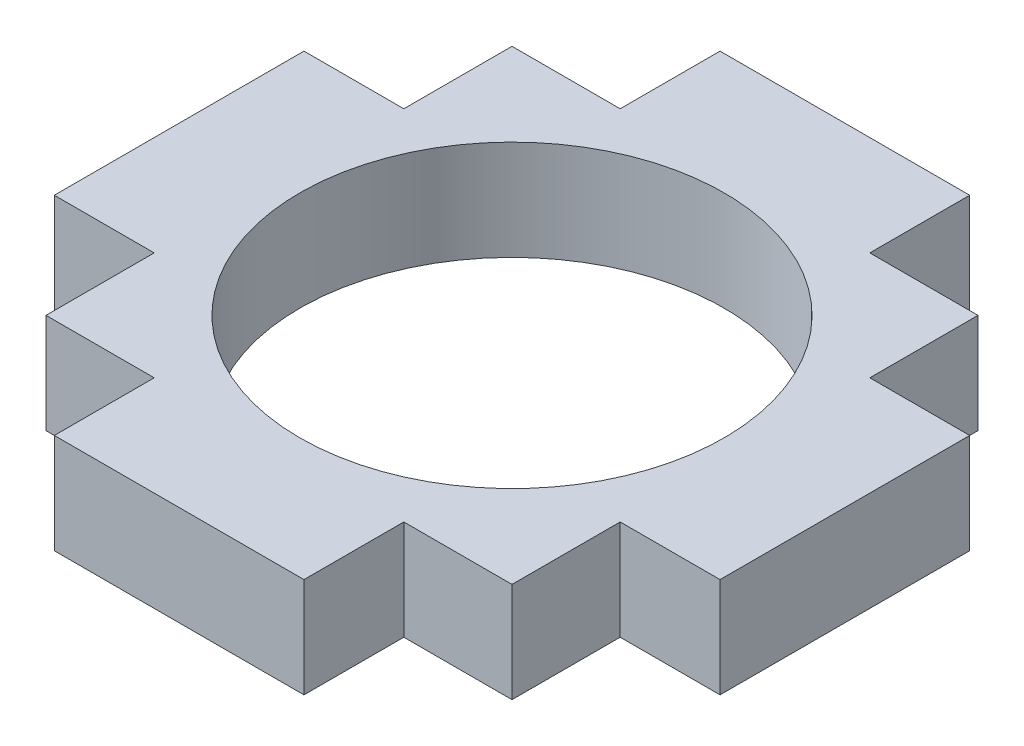
ISO-10303-21;
HEADER;
FILE_DESCRIPTION(('STEP AP214'),'2;1');
FILE_NAME('part.step','',(''),(''),'','','');
FILE_SCHEMA(('AUTOMOTIVE_DESIGN { 1 0 10303 214 1 1 1 1 }'));
ENDSEC;
DATA;
#1=APPLICATION_CONTEXT('core data for automotive mechanical design processes');
#2=APPLICATION_PROTOCOL_DEFINITION('international standard','automotive_design',2000,#1);
#3=PRODUCT_CONTEXT('',#1,'mechanical');
#4=PRODUCT('Part','Part','',(#3));
#5=PRODUCT_RELATED_PRODUCT_CATEGORY('part','',(#4));
#6=PRODUCT_DEFINITION_FORMATION('','',#4);
#7=PRODUCT_DEFINITION_CONTEXT('part definition',#1,'design');
#8=PRODUCT_DEFINITION('design','',#6,#7);
#9=PRODUCT_DEFINITION_SHAPE('','',#8);
#10=(LENGTH_UNIT() NAMED_UNIT(*) SI_UNIT(.MILLI.,.METRE.));
#11=(NAMED_UNIT(*) PLANE_ANGLE_UNIT() SI_UNIT($,.RADIAN.));
#12=(NAMED_UNIT(*) SI_UNIT($,.STERADIAN.) SOLID_ANGLE_UNIT());
#13=UNCERTAINTY_MEASURE_WITH_UNIT(LENGTH_MEASURE(1.E-05),#10,'distance_accuracy_value','');
#14=(GEOMETRIC_REPRESENTATION_CONTEXT(3) GLOBAL_UNCERTAINTY_ASSIGNED_CONTEXT((#13)) GLOBAL_UNIT_ASSIGNED_CONTEXT((#10,
#11,#12)) REPRESENTATION_CONTEXT('',''));
#15=CARTESIAN_POINT('',(0.,0.,0.));
#16=DIRECTION('',(0.,0.,1.));
#17=DIRECTION('',(1.,0.,0.));
#18=AXIS2_PLACEMENT_3D('',#15,#16,#17);
#19=CARTESIAN_POINT('',(27.5,6.,0.));
#20=DIRECTION('',(-1.,0.,0.));
#21=DIRECTION('',(0.,0.,1.));
#22=AXIS2_PLACEMENT_3D('',#19,#20,#21);
#23=PLANE('',#22);
#24=DIRECTION('',(0.,0.,-1.));
#25=VECTOR('',#24,1.);
#26=CARTESIAN_POINT('',(27.5,0.,0.));
#27=LINE('',#26,#25);
#28=CARTESIAN_POINT('',(27.5,0.,0.));
#29=VERTEX_POINT('',#28);
#30=CARTESIAN_POINT('',(27.5,0.,-5.99999999999999));
#31=VERTEX_POINT('',#30);
#32=EDGE_CURVE('E218',#29,#31,#27,.T.);
#33=ORIENTED_EDGE('',*,*,#32,.T.);
#34=DIRECTION('',(0.,-1.,0.));
#35=VECTOR('',#34,1.);
#36=CARTESIAN_POINT('',(27.5,6.,-5.99999999999999));
#37=LINE('',#36,#35);
#38=CARTESIAN_POINT('',(27.5,6.,-5.99999999999999));
#39=VERTEX_POINT('',#38);
#40=EDGE_CURVE('E11',#39,#31,#37,.T.);
#41=ORIENTED_EDGE('',*,*,#40,.F.);
#42=DIRECTION('',(0.,0.,-1.));
#43=VECTOR('',#42,1.);
#44=CARTESIAN_POINT('',(27.5,6.,0.));
#45=LINE('',#44,#43);
#46=CARTESIAN_POINT('',(27.5,6.,0.));
#47=VERTEX_POINT('',#46);
#48=EDGE_CURVE('E417',#47,#39,#45,.T.);
#49=ORIENTED_EDGE('',*,*,#48,.F.);
#50=DIRECTION('',(0.,-1.,0.));
#51=VECTOR('',#50,1.);
#52=CARTESIAN_POINT('',(27.5,6.,0.));
#53=LINE('',#52,#51);
#54=EDGE_CURVE('E210',#47,#29,#53,.T.);
#55=ORIENTED_EDGE('',*,*,#54,.T.);
#56=EDGE_LOOP('',(#33,#41,#49,#55));
#57=FACE_BOUND('',#56,.T.);
#58=ADVANCED_FACE('F41',(#57),#23,.F.);
#59=CARTESIAN_POINT('',(0.,6.,-5.99999999999996));
#60=DIRECTION('',(0.,0.,-1.));
#61=DIRECTION('',(-1.,0.,0.));
#62=AXIS2_PLACEMENT_3D('',#59,#60,#61);
#63=PLANE('',#62);
#64=DIRECTION('',(1.,0.,0.));
#65=VECTOR('',#64,1.);
#66=CARTESIAN_POINT('',(0.,0.,-5.99999999999996));
#67=LINE('',#66,#65);
#68=CARTESIAN_POINT('',(34.,0.,-6.));
#69=VERTEX_POINT('',#68);
#70=EDGE_CURVE('E222',#31,#69,#67,.T.);
#71=ORIENTED_EDGE('',*,*,#70,.T.);
#72=DIRECTION('',(0.,-1.,0.));
#73=VECTOR('',#72,1.);
#74=CARTESIAN_POINT('',(34.,6.,-6.));
#75=LINE('',#74,#73);
#76=CARTESIAN_POINT('',(34.,6.,-6.));
#77=VERTEX_POINT('',#76);
#78=EDGE_CURVE('E51',#77,#69,#75,.T.);
#79=ORIENTED_EDGE('',*,*,#78,.F.);
#80=DIRECTION('',(1.,0.,0.));
#81=VECTOR('',#80,1.);
#82=CARTESIAN_POINT('',(0.,6.,-5.99999999999996));
#83=LINE('',#82,#81);
#84=EDGE_CURVE('E134',#39,#77,#83,.T.);
#85=ORIENTED_EDGE('',*,*,#84,.F.);
#86=ORIENTED_EDGE('',*,*,#40,.T.);
#87=EDGE_LOOP('',(#71,#79,#85,#86));
#88=FACE_BOUND('',#87,.T.);
#89=ADVANCED_FACE('F431',(#88),#63,.F.);
#90=CARTESIAN_POINT('',(34.,6.,0.));
#91=DIRECTION('',(-1.,0.,0.));
#92=DIRECTION('',(0.,0.,1.));
#93=AXIS2_PLACEMENT_3D('',#90,#91,#92);
#94=PLANE('',#93);
#95=DIRECTION('',(0.,0.,-1.));
#96=VECTOR('',#95,1.);
#97=CARTESIAN_POINT('',(34.,0.,0.));
#98=LINE('',#97,#96);
#99=CARTESIAN_POINT('',(34.,0.,-12.5));
#100=VERTEX_POINT('',#99);
#101=EDGE_CURVE('E225',#69,#100,#98,.T.);
#102=ORIENTED_EDGE('',*,*,#101,.T.);
#103=DIRECTION('',(0.,-1.,0.));
#104=VECTOR('',#103,1.);
#105=CARTESIAN_POINT('',(34.,6.,-12.5));
#106=LINE('',#105,#104);
#107=CARTESIAN_POINT('',(34.,6.,-12.5));
#108=VERTEX_POINT('',#107);
#109=EDGE_CURVE('E337',#108,#100,#106,.T.);
#110=ORIENTED_EDGE('',*,*,#109,.F.);
#111=DIRECTION('',(0.,0.,-1.));
#112=VECTOR('',#111,1.);
#113=CARTESIAN_POINT('',(34.,6.,0.));
#114=LINE('',#113,#112);
#115=EDGE_CURVE('E347',#77,#108,#114,.T.);
#116=ORIENTED_EDGE('',*,*,#115,.F.);
#117=ORIENTED_EDGE('',*,*,#78,.T.);
#118=EDGE_LOOP('',(#102,#110,#116,#117));
#119=FACE_BOUND('',#118,.T.);
#120=ADVANCED_FACE('F345',(#119),#94,.F.);
#121=CARTESIAN_POINT('',(0.,6.,-12.5));
#122=DIRECTION('',(0.,0.,-1.));
#123=DIRECTION('',(-1.,0.,0.));
#124=AXIS2_PLACEMENT_3D('',#121,#122,#123);
#125=PLANE('',#124);
#126=DIRECTION('',(1.,0.,0.));
#127=VECTOR('',#126,1.);
#128=CARTESIAN_POINT('',(0.,0.,-12.5));
#129=LINE('',#128,#127);
#130=CARTESIAN_POINT('',(40.,0.,-12.5));
#131=VERTEX_POINT('',#130);
#132=EDGE_CURVE('E228',#100,#131,#129,.T.);
#133=ORIENTED_EDGE('',*,*,#132,.T.);
#134=DIRECTION('',(0.,-1.,0.));
#135=VECTOR('',#134,1.);
#136=CARTESIAN_POINT('',(40.,6.,-12.5));
#137=LINE('',#136,#135);
#138=CARTESIAN_POINT('',(40.,6.,-12.5));
#139=VERTEX_POINT('',#138);
#140=EDGE_CURVE('E333',#139,#131,#137,.T.);
#141=ORIENTED_EDGE('',*,*,#140,.F.);
#142=DIRECTION('',(1.,0.,0.));
#143=VECTOR('',#142,1.);
#144=CARTESIAN_POINT('',(0.,6.,-12.5));
#145=LINE('',#144,#143);
#146=EDGE_CURVE('E366',#108,#139,#145,.T.);
#147=ORIENTED_EDGE('',*,*,#146,.F.);
#148=ORIENTED_EDGE('',*,*,#109,.T.);
#149=EDGE_LOOP('',(#133,#141,#147,#148));
#150=FACE_BOUND('',#149,.T.);
#151=ADVANCED_FACE('F355',(#150),#125,.F.);
#152=CARTESIAN_POINT('',(40.,6.,0.));
#153=DIRECTION('',(-1.,0.,0.));
#154=DIRECTION('',(0.,0.,1.));
#155=AXIS2_PLACEMENT_3D('',#152,#153,#154);
#156=PLANE('',#155);
#157=DIRECTION('',(0.,0.,-1.));
#158=VECTOR('',#157,1.);
#159=CARTESIAN_POINT('',(40.,0.,0.));
#160=LINE('',#159,#158);
#161=CARTESIAN_POINT('',(40.,0.,-27.5));
#162=VERTEX_POINT('',#161);
#163=EDGE_CURVE('E231',#131,#162,#160,.T.);
#164=ORIENTED_EDGE('',*,*,#163,.T.);
#165=DIRECTION('',(0.,-1.,0.));
#166=VECTOR('',#165,1.);
#167=CARTESIAN_POINT('',(40.,6.,-27.5));
#168=LINE('',#167,#166);
#169=CARTESIAN_POINT('',(40.,6.,-27.5));
#170=VERTEX_POINT('',#169);
#171=EDGE_CURVE('E330',#170,#162,#168,.T.);
#172=ORIENTED_EDGE('',*,*,#171,.F.);
#173=DIRECTION('',(0.,0.,-1.));
#174=VECTOR('',#173,1.);
#175=CARTESIAN_POINT('',(40.,6.,0.));
#176=LINE('',#175,#174);
#177=EDGE_CURVE('E361',#139,#170,#176,.T.);
#178=ORIENTED_EDGE('',*,*,#177,.F.);
#179=ORIENTED_EDGE('',*,*,#140,.T.);
#180=EDGE_LOOP('',(#164,#172,#178,#179));
#181=FACE_BOUND('',#180,.T.);
#182=ADVANCED_FACE('F359',(#181),#156,.F.);
#183=CARTESIAN_POINT('',(0.,6.,-27.5));
#184=DIRECTION('',(0.,0.,-1.));
#185=DIRECTION('',(-1.,0.,0.));
#186=AXIS2_PLACEMENT_3D('',#183,#184,#185);
#187=PLANE('',#186);
#188=DIRECTION('',(1.,0.,0.));
#189=VECTOR('',#188,1.);
#190=CARTESIAN_POINT('',(0.,0.,-27.5));
#191=LINE('',#190,#189);
#192=CARTESIAN_POINT('',(34.,0.,-27.5));
#193=VERTEX_POINT('',#192);
#194=EDGE_CURVE('E235',#193,#162,#191,.T.);
#195=ORIENTED_EDGE('',*,*,#194,.F.);
#196=DIRECTION('',(0.,-1.,0.));
#197=VECTOR('',#196,1.);
#198=CARTESIAN_POINT('',(34.,6.,-27.5));
#199=LINE('',#198,#197);
#200=CARTESIAN_POINT('',(34.,6.,-27.5));
#201=VERTEX_POINT('',#200);
#202=EDGE_CURVE('E327',#201,#193,#199,.T.);
#203=ORIENTED_EDGE('',*,*,#202,.F.);
#204=DIRECTION('',(1.,0.,0.));
#205=VECTOR('',#204,1.);
#206=CARTESIAN_POINT('',(0.,6.,-27.5));
#207=LINE('',#206,#205);
#208=EDGE_CURVE('E365',#201,#170,#207,.T.);
#209=ORIENTED_EDGE('',*,*,#208,.T.);
#210=ORIENTED_EDGE('',*,*,#171,.T.);
#211=EDGE_LOOP('',(#195,#203,#209,#210));
#212=FACE_BOUND('',#211,.T.);
#213=ADVANCED_FACE('F443',(#212),#187,.T.);
#214=CARTESIAN_POINT('',(34.,6.,0.));
#215=DIRECTION('',(1.,0.,0.));
#216=DIRECTION('',(0.,0.,-1.));
#217=AXIS2_PLACEMENT_3D('',#214,#215,#216);
#218=PLANE('',#217);
#219=DIRECTION('',(0.,0.,1.));
#220=VECTOR('',#219,1.);
#221=CARTESIAN_POINT('',(34.,0.,0.));
#222=LINE('',#221,#220);
#223=CARTESIAN_POINT('',(34.,0.,-34.));
#224=VERTEX_POINT('',#223);
#225=EDGE_CURVE('E239',#224,#193,#222,.T.);
#226=ORIENTED_EDGE('',*,*,#225,.F.);
#227=DIRECTION('',(0.,-1.,0.));
#228=VECTOR('',#227,1.);
#229=CARTESIAN_POINT('',(34.,6.,-34.));
#230=LINE('',#229,#228);
#231=CARTESIAN_POINT('',(34.,6.,-34.));
#232=VERTEX_POINT('',#231);
#233=EDGE_CURVE('E324',#232,#224,#230,.T.);
#234=ORIENTED_EDGE('',*,*,#233,.F.);
#235=DIRECTION('',(0.,0.,1.));
#236=VECTOR('',#235,1.);
#237=CARTESIAN_POINT('',(34.,6.,0.));
#238=LINE('',#237,#236);
#239=EDGE_CURVE('E370',#232,#201,#238,.T.);
#240=ORIENTED_EDGE('',*,*,#239,.T.);
#241=ORIENTED_EDGE('',*,*,#202,.T.);
#242=EDGE_LOOP('',(#226,#234,#240,#241));
#243=FACE_BOUND('',#242,.T.);
#244=ADVANCED_FACE('F446',(#243),#218,.T.);
#245=CARTESIAN_POINT('',(0.,6.,-34.));
#246=DIRECTION('',(0.,0.,-1.));
#247=DIRECTION('',(-1.,0.,0.));
#248=AXIS2_PLACEMENT_3D('',#245,#246,#247);
#249=PLANE('',#248);
#250=DIRECTION('',(1.,0.,0.));
#251=VECTOR('',#250,1.);
#252=CARTESIAN_POINT('',(0.,0.,-34.));
#253=LINE('',#252,#251);
#254=CARTESIAN_POINT('',(27.5,0.,-34.));
#255=VERTEX_POINT('',#254);
#256=EDGE_CURVE('E243',#255,#224,#253,.T.);
#257=ORIENTED_EDGE('',*,*,#256,.F.);
#258=DIRECTION('',(0.,-1.,0.));
#259=VECTOR('',#258,1.);
#260=CARTESIAN_POINT('',(27.5,6.,-34.));
#261=LINE('',#260,#259);
#262=CARTESIAN_POINT('',(27.5,6.,-34.));
#263=VERTEX_POINT('',#262);
#264=EDGE_CURVE('E321',#263,#255,#261,.T.);
#265=ORIENTED_EDGE('',*,*,#264,.F.);
#266=DIRECTION('',(1.,0.,0.));
#267=VECTOR('',#266,1.);
#268=CARTESIAN_POINT('',(0.,6.,-34.));
#269=LINE('',#268,#267);
#270=EDGE_CURVE('E378',#263,#232,#269,.T.);
#271=ORIENTED_EDGE('',*,*,#270,.T.);
#272=ORIENTED_EDGE('',*,*,#233,.T.);
#273=EDGE_LOOP('',(#257,#265,#271,#272));
#274=FACE_BOUND('',#273,.T.);
#275=ADVANCED_FACE('F450',(#274),#249,.T.);
#276=CARTESIAN_POINT('',(27.5,6.,0.));
#277=DIRECTION('',(1.,0.,0.));
#278=DIRECTION('',(0.,0.,-1.));
#279=AXIS2_PLACEMENT_3D('',#276,#277,#278);
#280=PLANE('',#279);
#281=DIRECTION('',(0.,0.,1.));
#282=VECTOR('',#281,1.);
#283=CARTESIAN_POINT('',(27.5,0.,0.));
#284=LINE('',#283,#282);
#285=CARTESIAN_POINT('',(27.5,0.,-40.));
#286=VERTEX_POINT('',#285);
#287=EDGE_CURVE('E247',#286,#255,#284,.T.);
#288=ORIENTED_EDGE('',*,*,#287,.F.);
#289=DIRECTION('',(0.,-1.,0.));
#290=VECTOR('',#289,1.);
#291=CARTESIAN_POINT('',(27.5,6.,-40.));
#292=LINE('',#291,#290);
#293=CARTESIAN_POINT('',(27.5,6.,-40.));
#294=VERTEX_POINT('',#293);
#295=EDGE_CURVE('E318',#294,#286,#292,.T.);
#296=ORIENTED_EDGE('',*,*,#295,.F.);
#297=DIRECTION('',(0.,0.,1.));
#298=VECTOR('',#297,1.);
#299=CARTESIAN_POINT('',(27.5,6.,0.));
#300=LINE('',#299,#298);
#301=EDGE_CURVE('E382',#294,#263,#300,.T.);
#302=ORIENTED_EDGE('',*,*,#301,.T.);
#303=ORIENTED_EDGE('',*,*,#264,.T.);
#304=EDGE_LOOP('',(#288,#296,#302,#303));
#305=FACE_BOUND('',#304,.T.);
#306=ADVANCED_FACE('F454',(#305),#280,.T.);
#307=CARTESIAN_POINT('',(0.,6.,-40.));
#308=DIRECTION('',(0.,0.,-1.));
#309=DIRECTION('',(-1.,0.,0.));
#310=AXIS2_PLACEMENT_3D('',#307,#308,#309);
#311=PLANE('',#310);
#312=DIRECTION('',(1.,0.,0.));
#313=VECTOR('',#312,1.);
#314=CARTESIAN_POINT('',(0.,0.,-40.));
#315=LINE('',#314,#313);
#316=CARTESIAN_POINT('',(12.5,0.,-40.));
#317=VERTEX_POINT('',#316);
#318=EDGE_CURVE('E251',#317,#286,#315,.T.);
#319=ORIENTED_EDGE('',*,*,#318,.F.);
#320=DIRECTION('',(0.,-1.,0.));
#321=VECTOR('',#320,1.);
#322=CARTESIAN_POINT('',(12.5,6.,-40.));
#323=LINE('',#322,#321);
#324=CARTESIAN_POINT('',(12.5,6.,-40.));
#325=VERTEX_POINT('',#324);
#326=EDGE_CURVE('E315',#325,#317,#323,.T.);
#327=ORIENTED_EDGE('',*,*,#326,.F.);
#328=DIRECTION('',(1.,0.,0.));
#329=VECTOR('',#328,1.);
#330=CARTESIAN_POINT('',(0.,6.,-40.));
#331=LINE('',#330,#329);
#332=EDGE_CURVE('E386',#325,#294,#331,.T.);
#333=ORIENTED_EDGE('',*,*,#332,.T.);
#334=ORIENTED_EDGE('',*,*,#295,.T.);
#335=EDGE_LOOP('',(#319,#327,#333,#334));
#336=FACE_BOUND('',#335,.T.);
#337=ADVANCED_FACE('F458',(#336),#311,.T.);
#338=CARTESIAN_POINT('',(12.5,6.,0.));
#339=DIRECTION('',(1.,0.,0.));
#340=DIRECTION('',(0.,0.,-1.));
#341=AXIS2_PLACEMENT_3D('',#338,#339,#340);
#342=PLANE('',#341);
#343=DIRECTION('',(0.,0.,1.));
#344=VECTOR('',#343,1.);
#345=CARTESIAN_POINT('',(12.5,0.,0.));
#346=LINE('',#345,#344);
#347=CARTESIAN_POINT('',(12.5,0.,-34.));
#348=VERTEX_POINT('',#347);
#349=EDGE_CURVE('E255',#317,#348,#346,.T.);
#350=ORIENTED_EDGE('',*,*,#349,.T.);
#351=DIRECTION('',(0.,-1.,0.));
#352=VECTOR('',#351,1.);
#353=CARTESIAN_POINT('',(12.5,6.,-34.));
#354=LINE('',#353,#352);
#355=CARTESIAN_POINT('',(12.5,6.,-34.));
#356=VERTEX_POINT('',#355);
#357=EDGE_CURVE('E311',#356,#348,#354,.T.);
#358=ORIENTED_EDGE('',*,*,#357,.F.);
#359=DIRECTION('',(0.,0.,1.));
#360=VECTOR('',#359,1.);
#361=CARTESIAN_POINT('',(12.5,6.,0.));
#362=LINE('',#361,#360);
#363=EDGE_CURVE('E390',#325,#356,#362,.T.);
#364=ORIENTED_EDGE('',*,*,#363,.F.);
#365=ORIENTED_EDGE('',*,*,#326,.T.);
#366=EDGE_LOOP('',(#350,#358,#364,#365));
#367=FACE_BOUND('',#366,.T.);
#368=ADVANCED_FACE('F462',(#367),#342,.F.);
#369=CARTESIAN_POINT('',(0.,6.,-34.));
#370=DIRECTION('',(0.,0.,1.));
#371=DIRECTION('',(1.,0.,0.));
#372=AXIS2_PLACEMENT_3D('',#369,#370,#371);
#373=PLANE('',#372);
#374=DIRECTION('',(-1.,0.,0.));
#375=VECTOR('',#374,1.);
#376=CARTESIAN_POINT('',(0.,0.,-34.));
#377=LINE('',#376,#375);
#378=CARTESIAN_POINT('',(6.,0.,-34.));
#379=VERTEX_POINT('',#378);
#380=EDGE_CURVE('E258',#348,#379,#377,.T.);
#381=ORIENTED_EDGE('',*,*,#380,.T.);
#382=DIRECTION('',(0.,-1.,0.));
#383=VECTOR('',#382,1.);
#384=CARTESIAN_POINT('',(6.,6.,-34.));
#385=LINE('',#384,#383);
#386=CARTESIAN_POINT('',(6.,6.,-34.));
#387=VERTEX_POINT('',#386);
#388=EDGE_CURVE('E307',#387,#379,#385,.T.);
#389=ORIENTED_EDGE('',*,*,#388,.F.);
#390=DIRECTION('',(-1.,0.,0.));
#391=VECTOR('',#390,1.);
#392=CARTESIAN_POINT('',(0.,6.,-34.));
#393=LINE('',#392,#391);
#394=EDGE_CURVE('E393',#356,#387,#393,.T.);
#395=ORIENTED_EDGE('',*,*,#394,.F.);
#396=ORIENTED_EDGE('',*,*,#357,.T.);
#397=EDGE_LOOP('',(#381,#389,#395,#396));
#398=FACE_BOUND('',#397,.T.);
#399=ADVANCED_FACE('F466',(#398),#373,.F.);
#400=CARTESIAN_POINT('',(6.,6.,0.));
#401=DIRECTION('',(1.,0.,0.));
#402=DIRECTION('',(0.,0.,-1.));
#403=AXIS2_PLACEMENT_3D('',#400,#401,#402);
#404=PLANE('',#403);
#405=DIRECTION('',(0.,0.,1.));
#406=VECTOR('',#405,1.);
#407=CARTESIAN_POINT('',(6.,0.,0.));
#408=LINE('',#407,#406);
#409=CARTESIAN_POINT('',(6.,0.,-27.5));
#410=VERTEX_POINT('',#409);
#411=EDGE_CURVE('E261',#379,#410,#408,.T.);
#412=ORIENTED_EDGE('',*,*,#411,.T.);
#413=DIRECTION('',(0.,-1.,0.));
#414=VECTOR('',#413,1.);
#415=CARTESIAN_POINT('',(6.,6.,-27.5));
#416=LINE('',#415,#414);
#417=CARTESIAN_POINT('',(6.,6.,-27.5));
#418=VERTEX_POINT('',#417);
#419=EDGE_CURVE('E303',#418,#410,#416,.T.);
#420=ORIENTED_EDGE('',*,*,#419,.F.);
#421=DIRECTION('',(0.,0.,1.));
#422=VECTOR('',#421,1.);
#423=CARTESIAN_POINT('',(6.,6.,0.));
#424=LINE('',#423,#422);
#425=EDGE_CURVE('E396',#387,#418,#424,.T.);
#426=ORIENTED_EDGE('',*,*,#425,.F.);
#427=ORIENTED_EDGE('',*,*,#388,.T.);
#428=EDGE_LOOP('',(#412,#420,#426,#427));
#429=FACE_BOUND('',#428,.T.);
#430=ADVANCED_FACE('F470',(#429),#404,.F.);
#431=CARTESIAN_POINT('',(0.,6.,-27.5));
#432=DIRECTION('',(0.,0.,1.));
#433=DIRECTION('',(1.,0.,0.));
#434=AXIS2_PLACEMENT_3D('',#431,#432,#433);
#435=PLANE('',#434);
#436=DIRECTION('',(-1.,0.,0.));
#437=VECTOR('',#436,1.);
#438=CARTESIAN_POINT('',(0.,0.,-27.5));
#439=LINE('',#438,#437);
#440=CARTESIAN_POINT('',(0.,0.,-27.5));
#441=VERTEX_POINT('',#440);
#442=EDGE_CURVE('E264',#410,#441,#439,.T.);
#443=ORIENTED_EDGE('',*,*,#442,.T.);
#444=DIRECTION('',(0.,-1.,0.));
#445=VECTOR('',#444,1.);
#446=CARTESIAN_POINT('',(0.,6.,-27.5));
#447=LINE('',#446,#445);
#448=CARTESIAN_POINT('',(0.,6.,-27.5));
#449=VERTEX_POINT('',#448);
#450=EDGE_CURVE('E300',#449,#441,#447,.T.);
#451=ORIENTED_EDGE('',*,*,#450,.F.);
#452=DIRECTION('',(-1.,0.,0.));
#453=VECTOR('',#452,1.);
#454=CARTESIAN_POINT('',(0.,6.,-27.5));
#455=LINE('',#454,#453);
#456=EDGE_CURVE('E399',#418,#449,#455,.T.);
#457=ORIENTED_EDGE('',*,*,#456,.F.);
#458=ORIENTED_EDGE('',*,*,#419,.T.);
#459=EDGE_LOOP('',(#443,#451,#457,#458));
#460=FACE_BOUND('',#459,.T.);
#461=ADVANCED_FACE('F474',(#460),#435,.F.);
#462=CARTESIAN_POINT('',(0.,6.,0.));
#463=DIRECTION('',(-1.,0.,0.));
#464=DIRECTION('',(0.,0.,1.));
#465=AXIS2_PLACEMENT_3D('',#462,#463,#464);
#466=PLANE('',#465);
#467=DIRECTION('',(0.,0.,-1.));
#468=VECTOR('',#467,1.);
#469=CARTESIAN_POINT('',(0.,0.,0.));
#470=LINE('',#469,#468);
#471=CARTESIAN_POINT('',(0.,0.,-12.5));
#472=VERTEX_POINT('',#471);
#473=EDGE_CURVE('E268',#472,#441,#470,.T.);
#474=ORIENTED_EDGE('',*,*,#473,.F.);
#475=DIRECTION('',(0.,-1.,0.));
#476=VECTOR('',#475,1.);
#477=CARTESIAN_POINT('',(0.,6.,-12.5));
#478=LINE('',#477,#476);
#479=CARTESIAN_POINT('',(0.,6.,-12.5));
#480=VERTEX_POINT('',#479);
#481=EDGE_CURVE('E297',#480,#472,#478,.T.);
#482=ORIENTED_EDGE('',*,*,#481,.F.);
#483=DIRECTION('',(0.,0.,-1.));
#484=VECTOR('',#483,1.);
#485=CARTESIAN_POINT('',(0.,6.,0.));
#486=LINE('',#485,#484);
#487=EDGE_CURVE('E402',#480,#449,#486,.T.);
#488=ORIENTED_EDGE('',*,*,#487,.T.);
#489=ORIENTED_EDGE('',*,*,#450,.T.);
#490=EDGE_LOOP('',(#474,#482,#488,#489));
#491=FACE_BOUND('',#490,.T.);
#492=ADVANCED_FACE('F478',(#491),#466,.T.);
#493=CARTESIAN_POINT('',(0.,6.,-12.5));
#494=DIRECTION('',(0.,0.,1.));
#495=DIRECTION('',(1.,0.,0.));
#496=AXIS2_PLACEMENT_3D('',#493,#494,#495);
#497=PLANE('',#496);
#498=DIRECTION('',(-1.,0.,0.));
#499=VECTOR('',#498,1.);
#500=CARTESIAN_POINT('',(0.,0.,-12.5));
#501=LINE('',#500,#499);
#502=CARTESIAN_POINT('',(6.,0.,-12.5));
#503=VERTEX_POINT('',#502);
#504=EDGE_CURVE('E272',#503,#472,#501,.T.);
#505=ORIENTED_EDGE('',*,*,#504,.F.);
#506=DIRECTION('',(0.,-1.,0.));
#507=VECTOR('',#506,1.);
#508=CARTESIAN_POINT('',(6.,6.,-12.5));
#509=LINE('',#508,#507);
#510=CARTESIAN_POINT('',(6.,6.,-12.5));
#511=VERTEX_POINT('',#510);
#512=EDGE_CURVE('E294',#511,#503,#509,.T.);
#513=ORIENTED_EDGE('',*,*,#512,.F.);
#514=DIRECTION('',(-1.,0.,0.));
#515=VECTOR('',#514,1.);
#516=CARTESIAN_POINT('',(0.,6.,-12.5));
#517=LINE('',#516,#515);
#518=EDGE_CURVE('E406',#511,#480,#517,.T.);
#519=ORIENTED_EDGE('',*,*,#518,.T.);
#520=ORIENTED_EDGE('',*,*,#481,.T.);
#521=EDGE_LOOP('',(#505,#513,#519,#520));
#522=FACE_BOUND('',#521,.T.);
#523=ADVANCED_FACE('F482',(#522),#497,.T.);
#524=CARTESIAN_POINT('',(6.,6.,0.));
#525=DIRECTION('',(-1.,0.,0.));
#526=DIRECTION('',(0.,0.,1.));
#527=AXIS2_PLACEMENT_3D('',#524,#525,#526);
#528=PLANE('',#527);
#529=DIRECTION('',(0.,0.,-1.));
#530=VECTOR('',#529,1.);
#531=CARTESIAN_POINT('',(6.,0.,0.));
#532=LINE('',#531,#530);
#533=CARTESIAN_POINT('',(6.,0.,-6.));
#534=VERTEX_POINT('',#533);
#535=EDGE_CURVE('E276',#534,#503,#532,.T.);
#536=ORIENTED_EDGE('',*,*,#535,.F.);
#537=DIRECTION('',(0.,-1.,0.));
#538=VECTOR('',#537,1.);
#539=CARTESIAN_POINT('',(6.,6.,-6.));
#540=LINE('',#539,#538);
#541=CARTESIAN_POINT('',(6.,6.,-6.));
#542=VERTEX_POINT('',#541);
#543=EDGE_CURVE('E196',#542,#534,#540,.T.);
#544=ORIENTED_EDGE('',*,*,#543,.F.);
#545=DIRECTION('',(0.,0.,-1.));
#546=VECTOR('',#545,1.);
#547=CARTESIAN_POINT('',(6.,6.,0.));
#548=LINE('',#547,#546);
#549=EDGE_CURVE('E203',#542,#511,#548,.T.);
#550=ORIENTED_EDGE('',*,*,#549,.T.);
#551=ORIENTED_EDGE('',*,*,#512,.T.);
#552=EDGE_LOOP('',(#536,#544,#550,#551));
#553=FACE_BOUND('',#552,.T.);
#554=ADVANCED_FACE('F412',(#553),#528,.T.);
#555=CARTESIAN_POINT('',(0.,6.,-6.));
#556=DIRECTION('',(0.,0.,1.));
#557=DIRECTION('',(1.,0.,0.));
#558=AXIS2_PLACEMENT_3D('',#555,#556,#557);
#559=PLANE('',#558);
#560=DIRECTION('',(-1.,0.,0.));
#561=VECTOR('',#560,1.);
#562=CARTESIAN_POINT('',(0.,0.,-6.));
#563=LINE('',#562,#561);
#564=CARTESIAN_POINT('',(12.5,0.,-5.99999999999999));
#565=VERTEX_POINT('',#564);
#566=EDGE_CURVE('E190',#565,#534,#563,.T.);
#567=ORIENTED_EDGE('',*,*,#566,.F.);
#568=DIRECTION('',(0.,-1.,0.));
#569=VECTOR('',#568,1.);
#570=CARTESIAN_POINT('',(12.5,6.,-5.99999999999999));
#571=LINE('',#570,#569);
#572=CARTESIAN_POINT('',(12.5,6.,-5.99999999999999));
#573=VERTEX_POINT('',#572);
#574=EDGE_CURVE('E185',#573,#565,#571,.T.);
#575=ORIENTED_EDGE('',*,*,#574,.F.);
#576=DIRECTION('',(-1.,0.,0.));
#577=VECTOR('',#576,1.);
#578=CARTESIAN_POINT('',(0.,6.,-6.));
#579=LINE('',#578,#577);
#580=EDGE_CURVE('E188',#573,#542,#579,.T.);
#581=ORIENTED_EDGE('',*,*,#580,.T.);
#582=ORIENTED_EDGE('',*,*,#543,.T.);
#583=EDGE_LOOP('',(#567,#575,#581,#582));
#584=FACE_BOUND('',#583,.T.);
#585=ADVANCED_FACE('F187',(#584),#559,.T.);
#586=CARTESIAN_POINT('',(12.5,6.,0.));
#587=DIRECTION('',(-1.,0.,0.));
#588=DIRECTION('',(0.,0.,1.));
#589=AXIS2_PLACEMENT_3D('',#586,#587,#588);
#590=PLANE('',#589);
#591=DIRECTION('',(0.,0.,-1.));
#592=VECTOR('',#591,1.);
#593=CARTESIAN_POINT('',(12.5,0.,0.));
#594=LINE('',#593,#592);
#595=CARTESIAN_POINT('',(12.5,0.,0.));
#596=VERTEX_POINT('',#595);
#597=EDGE_CURVE('E282',#596,#565,#594,.T.);
#598=ORIENTED_EDGE('',*,*,#597,.F.);
#599=DIRECTION('',(0.,-1.,0.));
#600=VECTOR('',#599,1.);
#601=CARTESIAN_POINT('',(12.5,6.,0.));
#602=LINE('',#601,#600);
#603=CARTESIAN_POINT('',(12.5,6.,0.));
#604=VERTEX_POINT('',#603);
#605=EDGE_CURVE('E123',#604,#596,#602,.T.);
#606=ORIENTED_EDGE('',*,*,#605,.F.);
#607=DIRECTION('',(0.,0.,-1.));
#608=VECTOR('',#607,1.);
#609=CARTESIAN_POINT('',(12.5,6.,0.));
#610=LINE('',#609,#608);
#611=EDGE_CURVE('E200',#604,#573,#610,.T.);
#612=ORIENTED_EDGE('',*,*,#611,.T.);
#613=ORIENTED_EDGE('',*,*,#574,.T.);
#614=EDGE_LOOP('',(#598,#606,#612,#613));
#615=FACE_BOUND('',#614,.T.);
#616=ADVANCED_FACE('F206',(#615),#590,.T.);
#617=CARTESIAN_POINT('',(20.,6.,-20.));
#618=DIRECTION('',(0.,-1.,0.));
#619=DIRECTION('',(0.,0.,-1.));
#620=AXIS2_PLACEMENT_3D('',#617,#618,#619);
#621=CYLINDRICAL_SURFACE('',#620,12.75);
#622=CARTESIAN_POINT('',(20.,6.,-20.));
#623=DIRECTION('',(0.,1.,0.));
#624=DIRECTION('',(0.,0.,1.));
#625=AXIS2_PLACEMENT_3D('',#622,#623,#624);
#626=CIRCLE('',#625,12.75);
#627=CARTESIAN_POINT('',(20.,6.,-7.25));
#628=VERTEX_POINT('',#627);
#629=EDGE_CURVE('E287',#628,#628,#626,.T.);
#630=ORIENTED_EDGE('',*,*,#629,.T.);
#631=EDGE_LOOP('',(#630));
#632=FACE_BOUND('',#631,.T.);
#633=CARTESIAN_POINT('',(20.,0.,-20.));
#634=DIRECTION('',(0.,1.,0.));
#635=DIRECTION('',(0.,0.,1.));
#636=AXIS2_PLACEMENT_3D('',#633,#634,#635);
#637=CIRCLE('',#636,12.75);
#638=CARTESIAN_POINT('',(20.,0.,-7.25));
#639=VERTEX_POINT('',#638);
#640=EDGE_CURVE('E214',#639,#639,#637,.T.);
#641=ORIENTED_EDGE('',*,*,#640,.F.);
#642=EDGE_LOOP('',(#641));
#643=FACE_BOUND('',#642,.T.);
#644=ADVANCED_FACE('F43',(#632,#643),#621,.F.);
#645=CARTESIAN_POINT('',(0.,6.,0.));
#646=DIRECTION('',(0.,0.,-1.));
#647=DIRECTION('',(-1.,0.,0.));
#648=AXIS2_PLACEMENT_3D('',#645,#646,#647);
#649=PLANE('',#648);
#650=DIRECTION('',(1.,0.,0.));
#651=VECTOR('',#650,1.);
#652=CARTESIAN_POINT('',(0.,0.,0.));
#653=LINE('',#652,#651);
#654=EDGE_CURVE('E126',#596,#29,#653,.T.);
#655=ORIENTED_EDGE('',*,*,#654,.T.);
#656=ORIENTED_EDGE('',*,*,#54,.F.);
#657=DIRECTION('',(1.,0.,0.));
#658=VECTOR('',#657,1.);
#659=CARTESIAN_POINT('',(0.,6.,0.));
#660=LINE('',#659,#658);
#661=EDGE_CURVE('E59',#604,#47,#660,.T.);
#662=ORIENTED_EDGE('',*,*,#661,.F.);
#663=ORIENTED_EDGE('',*,*,#605,.T.);
#664=EDGE_LOOP('',(#655,#656,#662,#663));
#665=FACE_BOUND('',#664,.T.);
#666=ADVANCED_FACE('F418',(#665),#649,.F.);
#667=CARTESIAN_POINT('',(0.,6.,0.));
#668=DIRECTION('',(0.,1.,0.));
#669=DIRECTION('',(0.,0.,1.));
#670=AXIS2_PLACEMENT_3D('',#667,#668,#669);
#671=PLANE('',#670);
#672=ORIENTED_EDGE('',*,*,#629,.F.);
#673=EDGE_LOOP('',(#672));
#674=FACE_BOUND('',#673,.T.);
#675=ORIENTED_EDGE('',*,*,#48,.T.);
#676=ORIENTED_EDGE('',*,*,#84,.T.);
#677=ORIENTED_EDGE('',*,*,#115,.T.);
#678=ORIENTED_EDGE('',*,*,#146,.T.);
#679=ORIENTED_EDGE('',*,*,#177,.T.);
#680=ORIENTED_EDGE('',*,*,#208,.F.);
#681=ORIENTED_EDGE('',*,*,#239,.F.);
#682=ORIENTED_EDGE('',*,*,#270,.F.);
#683=ORIENTED_EDGE('',*,*,#301,.F.);
#684=ORIENTED_EDGE('',*,*,#332,.F.);
#685=ORIENTED_EDGE('',*,*,#363,.T.);
#686=ORIENTED_EDGE('',*,*,#394,.T.);
#687=ORIENTED_EDGE('',*,*,#425,.T.);
#688=ORIENTED_EDGE('',*,*,#456,.T.);
#689=ORIENTED_EDGE('',*,*,#487,.F.);
#690=ORIENTED_EDGE('',*,*,#518,.F.);
#691=ORIENTED_EDGE('',*,*,#549,.F.);
#692=ORIENTED_EDGE('',*,*,#580,.F.);
#693=ORIENTED_EDGE('',*,*,#611,.F.);
#694=ORIENTED_EDGE('',*,*,#661,.T.);
#695=EDGE_LOOP('',(#675,#676,#677,#678,#679,#680,#681,#682,#683,#684,#685,#686,#687,#688,#689,
#690,#691,#692,#693,#694));
#696=FACE_BOUND('',#695,.T.);
#697=ADVANCED_FACE('F199',(#674,#696),#671,.T.);
#698=CARTESIAN_POINT('',(0.,0.,0.));
#699=DIRECTION('',(0.,1.,0.));
#700=DIRECTION('',(0.,0.,1.));
#701=AXIS2_PLACEMENT_3D('',#698,#699,#700);
#702=PLANE('',#701);
#703=ORIENTED_EDGE('',*,*,#640,.T.);
#704=EDGE_LOOP('',(#703));
#705=FACE_BOUND('',#704,.T.);
#706=ORIENTED_EDGE('',*,*,#32,.F.);
#707=ORIENTED_EDGE('',*,*,#654,.F.);
#708=ORIENTED_EDGE('',*,*,#597,.T.);
#709=ORIENTED_EDGE('',*,*,#566,.T.);
#710=ORIENTED_EDGE('',*,*,#535,.T.);
#711=ORIENTED_EDGE('',*,*,#504,.T.);
#712=ORIENTED_EDGE('',*,*,#473,.T.);
#713=ORIENTED_EDGE('',*,*,#442,.F.);
#714=ORIENTED_EDGE('',*,*,#411,.F.);
#715=ORIENTED_EDGE('',*,*,#380,.F.);
#716=ORIENTED_EDGE('',*,*,#349,.F.);
#717=ORIENTED_EDGE('',*,*,#318,.T.);
#718=ORIENTED_EDGE('',*,*,#287,.T.);
#719=ORIENTED_EDGE('',*,*,#256,.T.);
#720=ORIENTED_EDGE('',*,*,#225,.T.);
#721=ORIENTED_EDGE('',*,*,#194,.T.);
#722=ORIENTED_EDGE('',*,*,#163,.F.);
#723=ORIENTED_EDGE('',*,*,#132,.F.);
#724=ORIENTED_EDGE('',*,*,#101,.F.);
#725=ORIENTED_EDGE('',*,*,#70,.F.);
#726=EDGE_LOOP('',(#706,#707,#708,#709,#710,#711,#712,#713,#714,#715,#716,#717,#718,#719,#720,
#721,#722,#723,#724,#725));
#727=FACE_BOUND('',#726,.T.);
#728=ADVANCED_FACE('F351',(#705,#727),#702,.F.);
#729=CLOSED_SHELL('',(#58,#89,#120,#151,#182,#213,#244,#275,#306,#337,#368,#399,#430,#461,#492,
#523,#554,#585,#616,#644,#666,#697,#728));
#730=MANIFOLD_SOLID_BREP('B2',#729);
#731=ADVANCED_BREP_SHAPE_REPRESENTATION('',(#18,#730),#14);
#732=SHAPE_DEFINITION_REPRESENTATION(#9,#731);
ENDSEC;
END-ISO-10303-21;
